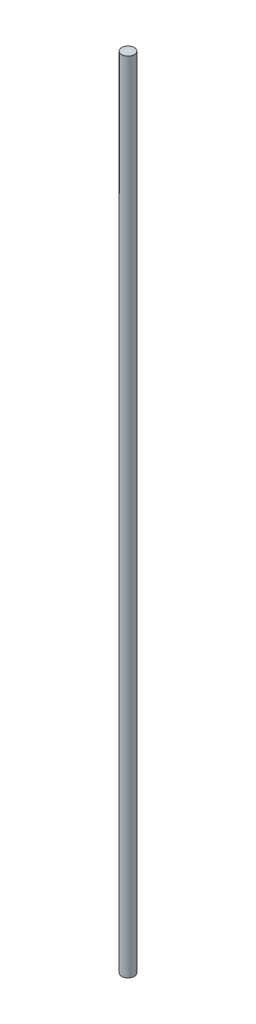
ISO-10303-21;
HEADER;
FILE_DESCRIPTION(('STEP AP214'),'2;1');
FILE_NAME('part.step','',(''),(''),'','','');
FILE_SCHEMA(('AUTOMOTIVE_DESIGN { 1 0 10303 214 1 1 1 1 }'));
ENDSEC;
DATA;
#1=APPLICATION_CONTEXT('core data for automotive mechanical design processes');
#2=APPLICATION_PROTOCOL_DEFINITION('international standard','automotive_design',2000,#1);
#3=PRODUCT_CONTEXT('',#1,'mechanical');
#4=PRODUCT('Part','Part','',(#3));
#5=PRODUCT_RELATED_PRODUCT_CATEGORY('part','',(#4));
#6=PRODUCT_DEFINITION_FORMATION('','',#4);
#7=PRODUCT_DEFINITION_CONTEXT('part definition',#1,'design');
#8=PRODUCT_DEFINITION('design','',#6,#7);
#9=PRODUCT_DEFINITION_SHAPE('','',#8);
#10=(LENGTH_UNIT() NAMED_UNIT(*) SI_UNIT(.MILLI.,.METRE.));
#11=(NAMED_UNIT(*) PLANE_ANGLE_UNIT() SI_UNIT($,.RADIAN.));
#12=(NAMED_UNIT(*) SI_UNIT($,.STERADIAN.) SOLID_ANGLE_UNIT());
#13=UNCERTAINTY_MEASURE_WITH_UNIT(LENGTH_MEASURE(1.E-05),#10,'distance_accuracy_value','');
#14=(GEOMETRIC_REPRESENTATION_CONTEXT(3) GLOBAL_UNCERTAINTY_ASSIGNED_CONTEXT((#13)) GLOBAL_UNIT_ASSIGNED_CONTEXT((#10,
#11,#12)) REPRESENTATION_CONTEXT('',''));
#15=CARTESIAN_POINT('',(0.,0.,0.));
#16=DIRECTION('',(0.,0.,1.));
#17=DIRECTION('',(1.,0.,0.));
#18=AXIS2_PLACEMENT_3D('',#15,#16,#17);
#19=CARTESIAN_POINT('',(0.,510.,0.));
#20=DIRECTION('',(0.,-1.,0.));
#21=DIRECTION('',(0.,0.,-1.));
#22=AXIS2_PLACEMENT_3D('',#19,#20,#21);
#23=CYLINDRICAL_SURFACE('',#22,4.);
#24=CARTESIAN_POINT('',(0.,510.,0.));
#25=DIRECTION('',(0.,1.,0.));
#26=DIRECTION('',(0.,0.,1.));
#27=AXIS2_PLACEMENT_3D('',#24,#25,#26);
#28=CIRCLE('',#27,4.);
#29=CARTESIAN_POINT('',(0.,510.,4.));
#30=VERTEX_POINT('',#29);
#31=EDGE_CURVE('E10',#30,#30,#28,.T.);
#32=ORIENTED_EDGE('',*,*,#31,.F.);
#33=EDGE_LOOP('',(#32));
#34=FACE_BOUND('',#33,.T.);
#35=CARTESIAN_POINT('',(0.,0.,0.));
#36=DIRECTION('',(0.,1.,0.));
#37=DIRECTION('',(0.,0.,1.));
#38=AXIS2_PLACEMENT_3D('',#35,#36,#37);
#39=CIRCLE('',#38,4.);
#40=CARTESIAN_POINT('',(0.,0.,4.));
#41=VERTEX_POINT('',#40);
#42=EDGE_CURVE('E40',#41,#41,#39,.T.);
#43=ORIENTED_EDGE('',*,*,#42,.T.);
#44=EDGE_LOOP('',(#43));
#45=FACE_BOUND('',#44,.T.);
#46=ADVANCED_FACE('F37',(#34,#45),#23,.T.);
#47=CARTESIAN_POINT('',(0.,510.,0.));
#48=DIRECTION('',(0.,1.,0.));
#49=DIRECTION('',(0.,0.,1.));
#50=AXIS2_PLACEMENT_3D('',#47,#48,#49);
#51=PLANE('',#50);
#52=ORIENTED_EDGE('',*,*,#31,.T.);
#53=EDGE_LOOP('',(#52));
#54=FACE_BOUND('',#53,.T.);
#55=ADVANCED_FACE('F54',(#54),#51,.T.);
#56=CARTESIAN_POINT('',(0.,0.,0.));
#57=DIRECTION('',(0.,1.,0.));
#58=DIRECTION('',(0.,0.,1.));
#59=AXIS2_PLACEMENT_3D('',#56,#57,#58);
#60=PLANE('',#59);
#61=ORIENTED_EDGE('',*,*,#42,.F.);
#62=EDGE_LOOP('',(#61));
#63=FACE_BOUND('',#62,.T.);
#64=ADVANCED_FACE('F52',(#63),#60,.F.);
#65=CLOSED_SHELL('',(#46,#55,#64));
#66=MANIFOLD_SOLID_BREP('B2',#65);
#67=ADVANCED_BREP_SHAPE_REPRESENTATION('',(#18,#66),#14);
#68=SHAPE_DEFINITION_REPRESENTATION(#9,#67);
ENDSEC;
END-ISO-10303-21;
